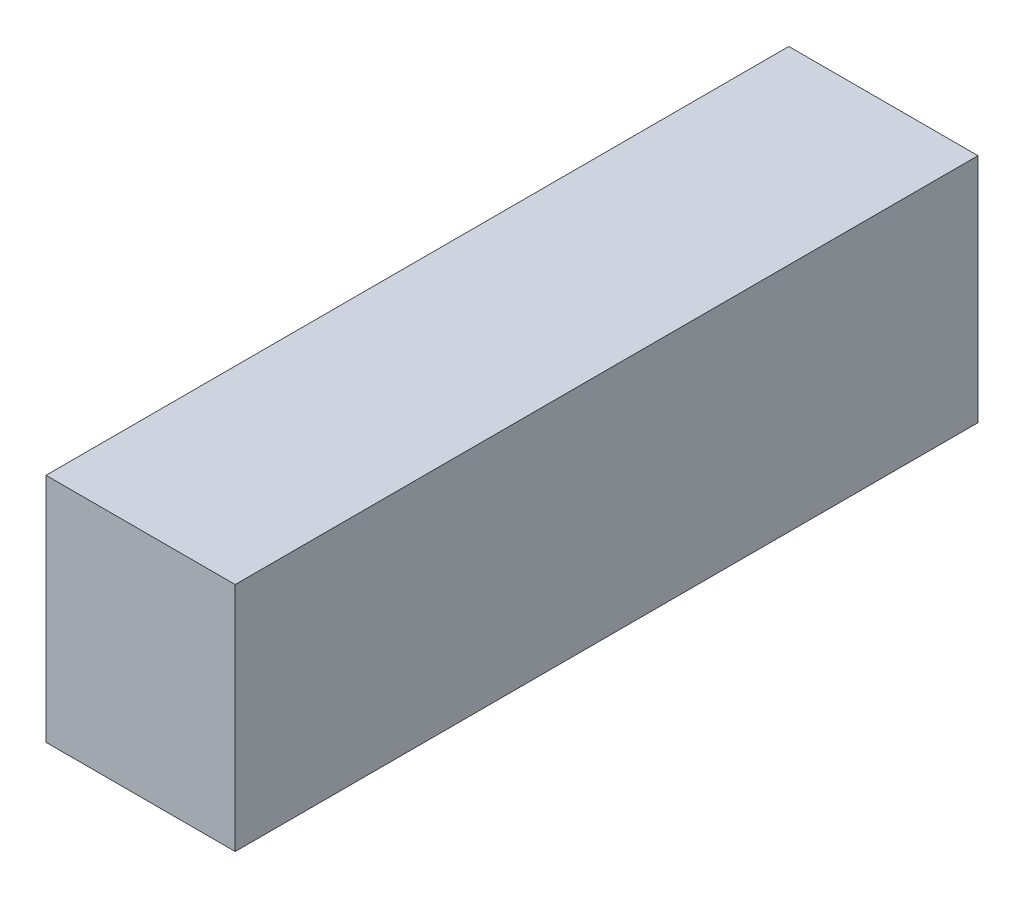
ISO-10303-21;
HEADER;
FILE_DESCRIPTION(('STEP AP214'),'2;1');
FILE_NAME('part.step','',(''),(''),'','','');
FILE_SCHEMA(('AUTOMOTIVE_DESIGN { 1 0 10303 214 1 1 1 1 }'));
ENDSEC;
DATA;
#1=APPLICATION_CONTEXT('core data for automotive mechanical design processes');
#2=APPLICATION_PROTOCOL_DEFINITION('international standard','automotive_design',2000,#1);
#3=PRODUCT_CONTEXT('',#1,'mechanical');
#4=PRODUCT('Part','Part','',(#3));
#5=PRODUCT_RELATED_PRODUCT_CATEGORY('part','',(#4));
#6=PRODUCT_DEFINITION_FORMATION('','',#4);
#7=PRODUCT_DEFINITION_CONTEXT('part definition',#1,'design');
#8=PRODUCT_DEFINITION('design','',#6,#7);
#9=PRODUCT_DEFINITION_SHAPE('','',#8);
#10=(LENGTH_UNIT() NAMED_UNIT(*) SI_UNIT(.MILLI.,.METRE.));
#11=(NAMED_UNIT(*) PLANE_ANGLE_UNIT() SI_UNIT($,.RADIAN.));
#12=(NAMED_UNIT(*) SI_UNIT($,.STERADIAN.) SOLID_ANGLE_UNIT());
#13=UNCERTAINTY_MEASURE_WITH_UNIT(LENGTH_MEASURE(1.E-05),#10,'distance_accuracy_value','');
#14=(GEOMETRIC_REPRESENTATION_CONTEXT(3) GLOBAL_UNCERTAINTY_ASSIGNED_CONTEXT((#13)) GLOBAL_UNIT_ASSIGNED_CONTEXT((#10,
#11,#12)) REPRESENTATION_CONTEXT('',''));
#15=CARTESIAN_POINT('',(0.,0.,0.));
#16=DIRECTION('',(0.,0.,1.));
#17=DIRECTION('',(1.,0.,0.));
#18=AXIS2_PLACEMENT_3D('',#15,#16,#17);
#19=CARTESIAN_POINT('',(-21.,18.,30.));
#20=DIRECTION('',(0.,0.,-1.));
#21=DIRECTION('',(-1.,0.,0.));
#22=AXIS2_PLACEMENT_3D('',#19,#20,#21);
#23=PLANE('',#22);
#24=DIRECTION('',(1.,0.,0.));
#25=VECTOR('',#24,1.);
#26=CARTESIAN_POINT('',(-21.,-15.,30.));
#27=LINE('',#26,#25);
#28=CARTESIAN_POINT('',(-21.,-15.,30.));
#29=VERTEX_POINT('',#28);
#30=CARTESIAN_POINT('',(6.,-15.,30.));
#31=VERTEX_POINT('',#30);
#32=EDGE_CURVE('E100',#29,#31,#27,.T.);
#33=ORIENTED_EDGE('',*,*,#32,.F.);
#34=DIRECTION('',(0.,-1.,0.));
#35=VECTOR('',#34,1.);
#36=CARTESIAN_POINT('',(-21.,18.,30.));
#37=LINE('',#36,#35);
#38=CARTESIAN_POINT('',(-21.,18.,30.));
#39=VERTEX_POINT('',#38);
#40=EDGE_CURVE('E11',#39,#29,#37,.T.);
#41=ORIENTED_EDGE('',*,*,#40,.F.);
#42=DIRECTION('',(1.,0.,0.));
#43=VECTOR('',#42,1.);
#44=CARTESIAN_POINT('',(-21.,18.,30.));
#45=LINE('',#44,#43);
#46=CARTESIAN_POINT('',(6.,18.,30.));
#47=VERTEX_POINT('',#46);
#48=EDGE_CURVE('E94',#39,#47,#45,.T.);
#49=ORIENTED_EDGE('',*,*,#48,.T.);
#50=DIRECTION('',(0.,-1.,0.));
#51=VECTOR('',#50,1.);
#52=CARTESIAN_POINT('',(6.,18.,30.));
#53=LINE('',#52,#51);
#54=EDGE_CURVE('E39',#47,#31,#53,.T.);
#55=ORIENTED_EDGE('',*,*,#54,.T.);
#56=EDGE_LOOP('',(#33,#41,#49,#55));
#57=FACE_BOUND('',#56,.T.);
#58=ADVANCED_FACE('F36',(#57),#23,.T.);
#59=CARTESIAN_POINT('',(-21.,18.,136.));
#60=DIRECTION('',(-1.,0.,0.));
#61=DIRECTION('',(0.,0.,1.));
#62=AXIS2_PLACEMENT_3D('',#59,#60,#61);
#63=PLANE('',#62);
#64=DIRECTION('',(0.,0.,-1.));
#65=VECTOR('',#64,1.);
#66=CARTESIAN_POINT('',(-21.,-15.,136.));
#67=LINE('',#66,#65);
#68=CARTESIAN_POINT('',(-21.,-15.,136.));
#69=VERTEX_POINT('',#68);
#70=EDGE_CURVE('E96',#69,#29,#67,.T.);
#71=ORIENTED_EDGE('',*,*,#70,.F.);
#72=DIRECTION('',(0.,-1.,0.));
#73=VECTOR('',#72,1.);
#74=CARTESIAN_POINT('',(-21.,18.,136.));
#75=LINE('',#74,#73);
#76=CARTESIAN_POINT('',(-21.,18.,136.));
#77=VERTEX_POINT('',#76);
#78=EDGE_CURVE('E45',#77,#69,#75,.T.);
#79=ORIENTED_EDGE('',*,*,#78,.F.);
#80=DIRECTION('',(0.,0.,-1.));
#81=VECTOR('',#80,1.);
#82=CARTESIAN_POINT('',(-21.,18.,136.));
#83=LINE('',#82,#81);
#84=EDGE_CURVE('E91',#77,#39,#83,.T.);
#85=ORIENTED_EDGE('',*,*,#84,.T.);
#86=ORIENTED_EDGE('',*,*,#40,.T.);
#87=EDGE_LOOP('',(#71,#79,#85,#86));
#88=FACE_BOUND('',#87,.T.);
#89=ADVANCED_FACE('F110',(#88),#63,.T.);
#90=CARTESIAN_POINT('',(6.,18.,136.));
#91=DIRECTION('',(0.,0.,1.));
#92=DIRECTION('',(1.,0.,0.));
#93=AXIS2_PLACEMENT_3D('',#90,#91,#92);
#94=PLANE('',#93);
#95=DIRECTION('',(-1.,0.,0.));
#96=VECTOR('',#95,1.);
#97=CARTESIAN_POINT('',(6.,-15.,136.));
#98=LINE('',#97,#96);
#99=CARTESIAN_POINT('',(6.,-15.,136.));
#100=VERTEX_POINT('',#99);
#101=EDGE_CURVE('E86',#100,#69,#98,.T.);
#102=ORIENTED_EDGE('',*,*,#101,.F.);
#103=DIRECTION('',(0.,-1.,0.));
#104=VECTOR('',#103,1.);
#105=CARTESIAN_POINT('',(6.,18.,136.));
#106=LINE('',#105,#104);
#107=CARTESIAN_POINT('',(6.,18.,136.));
#108=VERTEX_POINT('',#107);
#109=EDGE_CURVE('E81',#108,#100,#106,.T.);
#110=ORIENTED_EDGE('',*,*,#109,.F.);
#111=DIRECTION('',(-1.,0.,0.));
#112=VECTOR('',#111,1.);
#113=CARTESIAN_POINT('',(6.,18.,136.));
#114=LINE('',#113,#112);
#115=EDGE_CURVE('E84',#108,#77,#114,.T.);
#116=ORIENTED_EDGE('',*,*,#115,.T.);
#117=ORIENTED_EDGE('',*,*,#78,.T.);
#118=EDGE_LOOP('',(#102,#110,#116,#117));
#119=FACE_BOUND('',#118,.T.);
#120=ADVANCED_FACE('F83',(#119),#94,.T.);
#121=CARTESIAN_POINT('',(6.,18.,30.));
#122=DIRECTION('',(1.,0.,0.));
#123=DIRECTION('',(0.,0.,-1.));
#124=AXIS2_PLACEMENT_3D('',#121,#122,#123);
#125=PLANE('',#124);
#126=DIRECTION('',(0.,0.,1.));
#127=VECTOR('',#126,1.);
#128=CARTESIAN_POINT('',(6.,-15.,30.));
#129=LINE('',#128,#127);
#130=EDGE_CURVE('E103',#31,#100,#129,.T.);
#131=ORIENTED_EDGE('',*,*,#130,.F.);
#132=ORIENTED_EDGE('',*,*,#54,.F.);
#133=DIRECTION('',(0.,0.,1.));
#134=VECTOR('',#133,1.);
#135=CARTESIAN_POINT('',(6.,18.,30.));
#136=LINE('',#135,#134);
#137=EDGE_CURVE('E90',#47,#108,#136,.T.);
#138=ORIENTED_EDGE('',*,*,#137,.T.);
#139=ORIENTED_EDGE('',*,*,#109,.T.);
#140=EDGE_LOOP('',(#131,#132,#138,#139));
#141=FACE_BOUND('',#140,.T.);
#142=ADVANCED_FACE('F93',(#141),#125,.T.);
#143=CARTESIAN_POINT('',(0.,18.,0.));
#144=DIRECTION('',(0.,-1.,0.));
#145=DIRECTION('',(0.,0.,-1.));
#146=AXIS2_PLACEMENT_3D('',#143,#144,#145);
#147=PLANE('',#146);
#148=ORIENTED_EDGE('',*,*,#48,.F.);
#149=ORIENTED_EDGE('',*,*,#84,.F.);
#150=ORIENTED_EDGE('',*,*,#115,.F.);
#151=ORIENTED_EDGE('',*,*,#137,.F.);
#152=EDGE_LOOP('',(#148,#149,#150,#151));
#153=FACE_BOUND('',#152,.T.);
#154=ADVANCED_FACE('F89',(#153),#147,.F.);
#155=CARTESIAN_POINT('',(0.,-15.,0.));
#156=DIRECTION('',(0.,-1.,0.));
#157=DIRECTION('',(0.,0.,-1.));
#158=AXIS2_PLACEMENT_3D('',#155,#156,#157);
#159=PLANE('',#158);
#160=ORIENTED_EDGE('',*,*,#32,.T.);
#161=ORIENTED_EDGE('',*,*,#130,.T.);
#162=ORIENTED_EDGE('',*,*,#101,.T.);
#163=ORIENTED_EDGE('',*,*,#70,.T.);
#164=EDGE_LOOP('',(#160,#161,#162,#163));
#165=FACE_BOUND('',#164,.T.);
#166=ADVANCED_FACE('F109',(#165),#159,.T.);
#167=CLOSED_SHELL('',(#58,#89,#120,#142,#154,#166));
#168=MANIFOLD_SOLID_BREP('B2',#167);
#169=ADVANCED_BREP_SHAPE_REPRESENTATION('',(#18,#168),#14);
#170=SHAPE_DEFINITION_REPRESENTATION(#9,#169);
ENDSEC;
END-ISO-10303-21;
